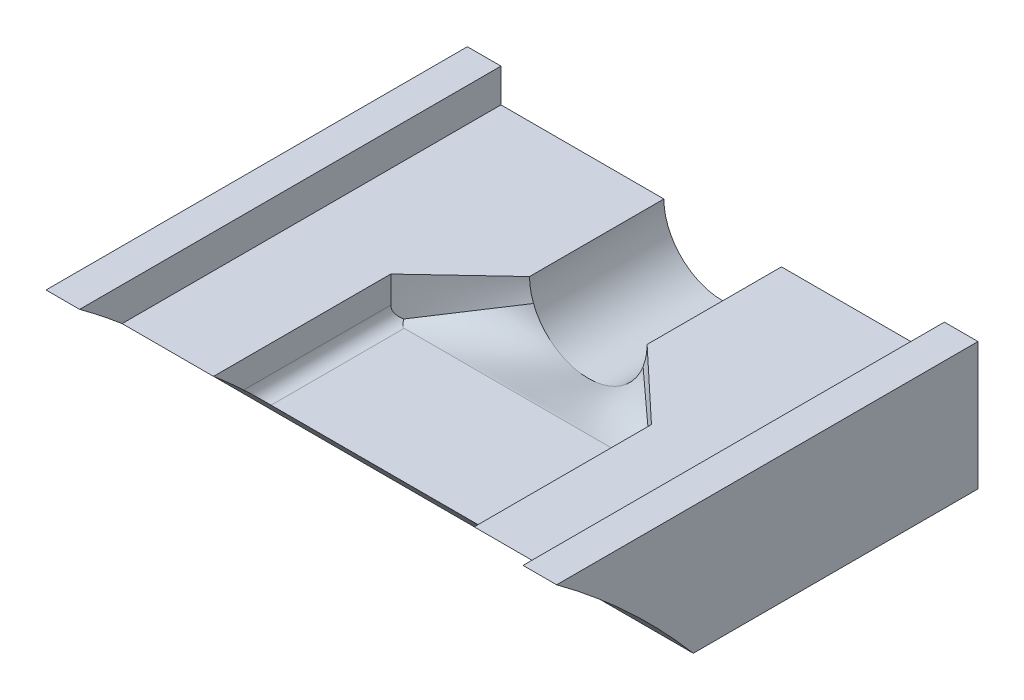
ISO-10303-21;
HEADER;
FILE_DESCRIPTION(('STEP AP214'),'2;1');
FILE_NAME('part.step','',(''),(''),'','','');
FILE_SCHEMA(('AUTOMOTIVE_DESIGN { 1 0 10303 214 1 1 1 1 }'));
ENDSEC;
DATA;
#1=APPLICATION_CONTEXT('core data for automotive mechanical design processes');
#2=APPLICATION_PROTOCOL_DEFINITION('international standard','automotive_design',2000,#1);
#3=PRODUCT_CONTEXT('',#1,'mechanical');
#4=PRODUCT('Part','Part','',(#3));
#5=PRODUCT_RELATED_PRODUCT_CATEGORY('part','',(#4));
#6=PRODUCT_DEFINITION_FORMATION('','',#4);
#7=PRODUCT_DEFINITION_CONTEXT('part definition',#1,'design');
#8=PRODUCT_DEFINITION('design','',#6,#7);
#9=PRODUCT_DEFINITION_SHAPE('','',#8);
#10=(LENGTH_UNIT() NAMED_UNIT(*) SI_UNIT(.MILLI.,.METRE.));
#11=(NAMED_UNIT(*) PLANE_ANGLE_UNIT() SI_UNIT($,.RADIAN.));
#12=(NAMED_UNIT(*) SI_UNIT($,.STERADIAN.) SOLID_ANGLE_UNIT());
#13=UNCERTAINTY_MEASURE_WITH_UNIT(LENGTH_MEASURE(1.E-05),#10,'distance_accuracy_value','');
#14=(GEOMETRIC_REPRESENTATION_CONTEXT(3) GLOBAL_UNCERTAINTY_ASSIGNED_CONTEXT((#13)) GLOBAL_UNIT_ASSIGNED_CONTEXT((#10,
#11,#12)) REPRESENTATION_CONTEXT('',''));
#15=CARTESIAN_POINT('',(0.,0.,0.));
#16=DIRECTION('',(0.,0.,1.));
#17=DIRECTION('',(1.,0.,0.));
#18=AXIS2_PLACEMENT_3D('',#15,#16,#17);
#19=CARTESIAN_POINT('',(-23.495,6.35,50.8));
#20=DIRECTION('',(0.,-1.,0.));
#21=DIRECTION('',(0.,0.,-1.));
#22=AXIS2_PLACEMENT_3D('',#19,#20,#21);
#23=PLANE('',#22);
#24=DIRECTION('',(0.,0.,-1.));
#25=VECTOR('',#24,1.);
#26=CARTESIAN_POINT('',(-20.32,6.35,50.800025));
#27=LINE('',#26,#25);
#28=CARTESIAN_POINT('',(-20.32,6.35,35.8059844851895));
#29=VERTEX_POINT('',#28);
#30=CARTESIAN_POINT('',(-20.32,6.35,0.));
#31=VERTEX_POINT('',#30);
#32=EDGE_CURVE('E504',#29,#31,#27,.T.);
#33=ORIENTED_EDGE('',*,*,#32,.F.);
#34=DIRECTION('',(1.,0.,0.));
#35=VECTOR('',#34,1.);
#36=CARTESIAN_POINT('',(-23.495,6.35,35.8059844851895));
#37=LINE('',#36,#35);
#38=CARTESIAN_POINT('',(-11.684,6.35,35.8059844851895));
#39=VERTEX_POINT('',#38);
#40=EDGE_CURVE('E602',#29,#39,#37,.T.);
#41=ORIENTED_EDGE('',*,*,#40,.T.);
#42=DIRECTION('',(0.,0.,1.));
#43=VECTOR('',#42,1.);
#44=CARTESIAN_POINT('',(-11.684,6.35,19.05));
#45=LINE('',#44,#43);
#46=CARTESIAN_POINT('',(-11.684,6.35,19.05));
#47=VERTEX_POINT('',#46);
#48=EDGE_CURVE('E297',#47,#39,#45,.T.);
#49=ORIENTED_EDGE('',*,*,#48,.F.);
#50=CARTESIAN_POINT('',(-4.92125,6.35,12.7));
#51=CARTESIAN_POINT('',(-7.1755,6.35,14.8166666666667));
#52=CARTESIAN_POINT('',(-9.42975,6.35,16.9333333333333));
#53=CARTESIAN_POINT('',(-11.684,6.35,19.05));
#54=B_SPLINE_CURVE_WITH_KNOTS('',3,(#50,#51,#52,#53),.UNSPECIFIED.,.F.,.F.,(4,4),(0.,1.),.UNSPECIFIED.);
#55=CARTESIAN_POINT('',(-4.92125,6.35,12.7));
#56=VERTEX_POINT('',#55);
#57=EDGE_CURVE('E572',#56,#47,#54,.T.);
#58=ORIENTED_EDGE('',*,*,#57,.F.);
#59=DIRECTION('',(0.,0.,-1.));
#60=VECTOR('',#59,1.);
#61=CARTESIAN_POINT('',(-4.92125,6.35,12.7));
#62=LINE('',#61,#60);
#63=CARTESIAN_POINT('',(-4.92125,6.35,0.));
#64=VERTEX_POINT('',#63);
#65=EDGE_CURVE('E244',#64,#56,#62,.F.);
#66=ORIENTED_EDGE('',*,*,#65,.F.);
#67=DIRECTION('',(-1.,0.,0.));
#68=VECTOR('',#67,1.);
#69=CARTESIAN_POINT('',(-23.495,6.35,0.));
#70=LINE('',#69,#68);
#71=EDGE_CURVE('E546',#64,#31,#70,.T.);
#72=ORIENTED_EDGE('',*,*,#71,.T.);
#73=EDGE_LOOP('',(#33,#41,#49,#58,#66,#72));
#74=FACE_BOUND('',#73,.T.);
#75=ADVANCED_FACE('F67',(#74),#23,.F.);
#76=DIRECTION('',(0.,0.,1.));
#77=VECTOR('',#76,1.);
#78=CARTESIAN_POINT('',(12.954,6.35,19.05));
#79=LINE('',#78,#77);
#80=CARTESIAN_POINT('',(12.954,6.35,19.05));
#81=VERTEX_POINT('',#80);
#82=CARTESIAN_POINT('',(12.954,6.35,35.8059844851895));
#83=VERTEX_POINT('',#82);
#84=EDGE_CURVE('E289',#81,#83,#79,.T.);
#85=ORIENTED_EDGE('',*,*,#84,.T.);
#86=DIRECTION('',(1.,0.,0.));
#87=VECTOR('',#86,1.);
#88=CARTESIAN_POINT('',(-23.495,6.35,35.8059844851895));
#89=LINE('',#88,#87);
#90=CARTESIAN_POINT('',(21.59,6.34999999999997,35.8059844851895));
#91=VERTEX_POINT('',#90);
#92=EDGE_CURVE('E526',#83,#91,#89,.T.);
#93=ORIENTED_EDGE('',*,*,#92,.T.);
#94=DIRECTION('',(0.,0.,-1.));
#95=VECTOR('',#94,1.);
#96=CARTESIAN_POINT('',(21.59,6.35,50.800025));
#97=LINE('',#96,#95);
#98=CARTESIAN_POINT('',(21.59,6.35,0.));
#99=VERTEX_POINT('',#98);
#100=EDGE_CURVE('E210',#91,#99,#97,.T.);
#101=ORIENTED_EDGE('',*,*,#100,.T.);
#102=CARTESIAN_POINT('',(6.19125,6.35,0.));
#103=VERTEX_POINT('',#102);
#104=EDGE_CURVE('E545',#99,#103,#70,.T.);
#105=ORIENTED_EDGE('',*,*,#104,.T.);
#106=DIRECTION('',(0.,0.,-1.));
#107=VECTOR('',#106,1.);
#108=CARTESIAN_POINT('',(6.19125,6.35,12.7));
#109=LINE('',#108,#107);
#110=CARTESIAN_POINT('',(6.19125,6.35,12.7));
#111=VERTEX_POINT('',#110);
#112=EDGE_CURVE('E623',#111,#103,#109,.T.);
#113=ORIENTED_EDGE('',*,*,#112,.F.);
#114=CARTESIAN_POINT('',(12.954,6.35,19.05));
#115=CARTESIAN_POINT('',(10.69975,6.35,16.9333333333333));
#116=CARTESIAN_POINT('',(8.4455,6.35,14.8166666666667));
#117=CARTESIAN_POINT('',(6.19125,6.35,12.7));
#118=B_SPLINE_CURVE_WITH_KNOTS('',3,(#114,#115,#116,#117),.UNSPECIFIED.,.F.,.F.,(4,4),(0.,1.),.UNSPECIFIED.);
#119=EDGE_CURVE('E568',#111,#81,#118,.F.);
#120=ORIENTED_EDGE('',*,*,#119,.T.);
#121=EDGE_LOOP('',(#85,#93,#101,#105,#113,#120));
#122=FACE_BOUND('',#121,.T.);
#123=ADVANCED_FACE('F264',(#122),#23,.F.);
#124=CARTESIAN_POINT('',(0.,0.,0.));
#125=DIRECTION('',(0.,0.,1.));
#126=DIRECTION('',(1.,0.,0.));
#127=AXIS2_PLACEMENT_3D('',#124,#125,#126);
#128=PLANE('',#127);
#129=CARTESIAN_POINT('',(0.635,6.34999999999999,0.));
#130=DIRECTION('',(0.,0.,1.));
#131=DIRECTION('',(1.,0.,0.));
#132=AXIS2_PLACEMENT_3D('',#129,#130,#131);
#133=CIRCLE('',#132,5.55625);
#134=EDGE_CURVE('E227',#103,#64,#133,.F.);
#135=ORIENTED_EDGE('',*,*,#134,.F.);
#136=ORIENTED_EDGE('',*,*,#104,.F.);
#137=DIRECTION('',(0.,1.,0.));
#138=VECTOR('',#137,1.);
#139=CARTESIAN_POINT('',(21.59,6.35,0.));
#140=LINE('',#139,#138);
#141=CARTESIAN_POINT('',(21.59,9.525,0.));
#142=VERTEX_POINT('',#141);
#143=EDGE_CURVE('E532',#99,#142,#140,.T.);
#144=ORIENTED_EDGE('',*,*,#143,.T.);
#145=DIRECTION('',(1.,0.,0.));
#146=VECTOR('',#145,1.);
#147=CARTESIAN_POINT('',(21.59,9.525,0.));
#148=LINE('',#147,#146);
#149=CARTESIAN_POINT('',(24.765,9.525,0.));
#150=VERTEX_POINT('',#149);
#151=EDGE_CURVE('E529',#142,#150,#148,.T.);
#152=ORIENTED_EDGE('',*,*,#151,.T.);
#153=DIRECTION('',(0.,1.,0.));
#154=VECTOR('',#153,1.);
#155=CARTESIAN_POINT('',(24.765,6.35,0.));
#156=LINE('',#155,#154);
#157=CARTESIAN_POINT('',(24.765,-2.54,0.));
#158=VERTEX_POINT('',#157);
#159=EDGE_CURVE('E549',#158,#150,#156,.T.);
#160=ORIENTED_EDGE('',*,*,#159,.F.);
#161=DIRECTION('',(1.,0.,0.));
#162=VECTOR('',#161,1.);
#163=CARTESIAN_POINT('',(-23.495,-2.54,0.));
#164=LINE('',#163,#162);
#165=CARTESIAN_POINT('',(-23.495,-2.54,0.));
#166=VERTEX_POINT('',#165);
#167=EDGE_CURVE('E223',#166,#158,#164,.T.);
#168=ORIENTED_EDGE('',*,*,#167,.F.);
#169=DIRECTION('',(0.,-1.,0.));
#170=VECTOR('',#169,1.);
#171=CARTESIAN_POINT('',(-23.495,6.35,0.));
#172=LINE('',#171,#170);
#173=CARTESIAN_POINT('',(-23.495,9.525,0.));
#174=VERTEX_POINT('',#173);
#175=EDGE_CURVE('E229',#174,#166,#172,.T.);
#176=ORIENTED_EDGE('',*,*,#175,.F.);
#177=DIRECTION('',(-1.,0.,0.));
#178=VECTOR('',#177,1.);
#179=CARTESIAN_POINT('',(0.,9.525,0.));
#180=LINE('',#179,#178);
#181=CARTESIAN_POINT('',(-20.32,9.525,0.));
#182=VERTEX_POINT('',#181);
#183=EDGE_CURVE('E509',#182,#174,#180,.T.);
#184=ORIENTED_EDGE('',*,*,#183,.F.);
#185=DIRECTION('',(0.,1.,0.));
#186=VECTOR('',#185,1.);
#187=CARTESIAN_POINT('',(-20.32,0.,0.));
#188=LINE('',#187,#186);
#189=EDGE_CURVE('E500',#31,#182,#188,.T.);
#190=ORIENTED_EDGE('',*,*,#189,.F.);
#191=ORIENTED_EDGE('',*,*,#71,.F.);
#192=EDGE_LOOP('',(#135,#136,#144,#152,#160,#168,#176,#184,#190,#191));
#193=FACE_BOUND('',#192,.T.);
#194=ADVANCED_FACE('F261',(#193),#128,.F.);
#195=CARTESIAN_POINT('',(24.765,6.35,50.8));
#196=DIRECTION('',(-1.,0.,0.));
#197=DIRECTION('',(0.,0.,1.));
#198=AXIS2_PLACEMENT_3D('',#195,#196,#197);
#199=PLANE('',#198);
#200=DIRECTION('',(0.,0.,-1.));
#201=VECTOR('',#200,1.);
#202=CARTESIAN_POINT('',(24.765,9.525,50.800025));
#203=LINE('',#202,#201);
#204=CARTESIAN_POINT('',(24.765,9.525,39.8240109496798));
#205=VERTEX_POINT('',#204);
#206=EDGE_CURVE('E219',#205,#150,#203,.T.);
#207=ORIENTED_EDGE('',*,*,#206,.F.);
#208=CARTESIAN_POINT('',(24.765,-51.8160000000001,85.0315514600857));
#209=DIRECTION('',(1.,0.,0.));
#210=DIRECTION('',(0.,0.,-1.));
#211=AXIS2_PLACEMENT_3D('',#208,#209,#210);
#212=CIRCLE('',#211,76.2);
#213=CARTESIAN_POINT('',(24.765,-2.54,26.9082702037767));
#214=VERTEX_POINT('',#213);
#215=EDGE_CURVE('E203',#214,#205,#212,.T.);
#216=ORIENTED_EDGE('',*,*,#215,.F.);
#217=DIRECTION('',(0.,0.,-1.));
#218=VECTOR('',#217,1.);
#219=CARTESIAN_POINT('',(24.765,-2.54,50.8));
#220=LINE('',#219,#218);
#221=EDGE_CURVE('E217',#214,#158,#220,.T.);
#222=ORIENTED_EDGE('',*,*,#221,.T.);
#223=ORIENTED_EDGE('',*,*,#159,.T.);
#224=EDGE_LOOP('',(#207,#216,#222,#223));
#225=FACE_BOUND('',#224,.T.);
#226=ADVANCED_FACE('F215',(#225),#199,.F.);
#227=CARTESIAN_POINT('',(-23.495,6.35,50.8));
#228=DIRECTION('',(1.,0.,0.));
#229=DIRECTION('',(0.,0.,-1.));
#230=AXIS2_PLACEMENT_3D('',#227,#228,#229);
#231=PLANE('',#230);
#232=DIRECTION('',(0.,0.,-1.));
#233=VECTOR('',#232,1.);
#234=CARTESIAN_POINT('',(-23.495,-2.54,50.8));
#235=LINE('',#234,#233);
#236=CARTESIAN_POINT('',(-23.495,-2.54,26.9082702037767));
#237=VERTEX_POINT('',#236);
#238=EDGE_CURVE('E225',#237,#166,#235,.T.);
#239=ORIENTED_EDGE('',*,*,#238,.F.);
#240=CARTESIAN_POINT('',(-23.495,-51.8160000000001,85.0315514600857));
#241=DIRECTION('',(1.,0.,0.));
#242=DIRECTION('',(0.,0.,-1.));
#243=AXIS2_PLACEMENT_3D('',#240,#241,#242);
#244=CIRCLE('',#243,76.2);
#245=CARTESIAN_POINT('',(-23.495,9.525,39.8240109496798));
#246=VERTEX_POINT('',#245);
#247=EDGE_CURVE('E206',#237,#246,#244,.T.);
#248=ORIENTED_EDGE('',*,*,#247,.T.);
#249=DIRECTION('',(0.,0.,-1.));
#250=VECTOR('',#249,1.);
#251=CARTESIAN_POINT('',(-23.495,9.525,50.800025));
#252=LINE('',#251,#250);
#253=EDGE_CURVE('E505',#246,#174,#252,.T.);
#254=ORIENTED_EDGE('',*,*,#253,.T.);
#255=ORIENTED_EDGE('',*,*,#175,.T.);
#256=EDGE_LOOP('',(#239,#248,#254,#255));
#257=FACE_BOUND('',#256,.T.);
#258=ADVANCED_FACE('F268',(#257),#231,.F.);
#259=CARTESIAN_POINT('',(-23.495,-2.54,50.8));
#260=DIRECTION('',(0.,1.,0.));
#261=DIRECTION('',(0.,0.,1.));
#262=AXIS2_PLACEMENT_3D('',#259,#260,#261);
#263=PLANE('',#262);
#264=ORIENTED_EDGE('',*,*,#221,.F.);
#265=DIRECTION('',(1.,0.,0.));
#266=VECTOR('',#265,1.);
#267=CARTESIAN_POINT('',(-23.495,-2.54,26.9082702037768));
#268=LINE('',#267,#266);
#269=EDGE_CURVE('E200',#214,#237,#268,.F.);
#270=ORIENTED_EDGE('',*,*,#269,.T.);
#271=ORIENTED_EDGE('',*,*,#238,.T.);
#272=ORIENTED_EDGE('',*,*,#167,.T.);
#273=EDGE_LOOP('',(#264,#270,#271,#272));
#274=FACE_BOUND('',#273,.T.);
#275=ADVANCED_FACE('F221',(#274),#263,.F.);
#276=CARTESIAN_POINT('',(0.635,6.34999999999999,12.7));
#277=DIRECTION('',(0.,0.,-1.));
#278=DIRECTION('',(-1.,0.,0.));
#279=AXIS2_PLACEMENT_3D('',#276,#277,#278);
#280=CYLINDRICAL_SURFACE('',#279,5.55625);
#281=ORIENTED_EDGE('',*,*,#65,.T.);
#282=CARTESIAN_POINT('',(-4.54312270854848,4.33531409948982,12.7));
#283=CARTESIAN_POINT('',(-4.60541918850231,4.49542780129806,12.7));
#284=CARTESIAN_POINT('',(-4.71515084943679,4.82144223525843,12.7));
#285=CARTESIAN_POINT('',(-4.83373627413655,5.32359085422753,12.7));
#286=CARTESIAN_POINT('',(-4.90530254184817,5.83458103714851,12.7));
#287=CARTESIAN_POINT('',(-4.92125,6.17819415341328,12.7));
#288=CARTESIAN_POINT('',(-4.92125,6.35,12.7));
#289=B_SPLINE_CURVE_WITH_KNOTS('',3,(#282,#283,#284,#285,#286,#287,#288),.UNSPECIFIED.,.F.,.F.,
(4,1,1,1,4),(0.,0.0295275590551181,0.0590551181102362,0.0885826771653544,0.118110236220472),.UNSPECIFIED.);
#290=CARTESIAN_POINT('',(-4.5431494251816,4.33530365676075,12.7));
#291=VERTEX_POINT('',#290);
#292=EDGE_CURVE('E239',#56,#291,#289,.F.);
#293=ORIENTED_EDGE('',*,*,#292,.T.);
#294=CARTESIAN_POINT('',(0.635,6.34999999999999,12.7));
#295=DIRECTION('',(0.,0.,1.));
#296=DIRECTION('',(1.,0.,0.));
#297=AXIS2_PLACEMENT_3D('',#294,#295,#296);
#298=CIRCLE('',#297,5.55625);
#299=CARTESIAN_POINT('',(5.81313583325495,4.33530897595926,12.7));
#300=VERTEX_POINT('',#299);
#301=EDGE_CURVE('E516',#291,#300,#298,.T.);
#302=ORIENTED_EDGE('',*,*,#301,.T.);
#303=EDGE_CURVE('E358',#300,#111,#298,.T.);
#304=ORIENTED_EDGE('',*,*,#303,.T.);
#305=ORIENTED_EDGE('',*,*,#112,.T.);
#306=ORIENTED_EDGE('',*,*,#134,.T.);
#307=EDGE_LOOP('',(#281,#293,#302,#304,#305,#306));
#308=FACE_BOUND('',#307,.T.);
#309=ADVANCED_FACE('F248',(#308),#280,.F.);
#310=CARTESIAN_POINT('',(-11.684,6.35,19.05));
#311=DIRECTION('',(-1.,0.,0.));
#312=DIRECTION('',(0.,-1.,0.));
#313=AXIS2_PLACEMENT_3D('',#310,#311,#312);
#314=PLANE('',#313);
#315=CARTESIAN_POINT('',(-11.684,-51.8160000000001,85.0315514600857));
#316=DIRECTION('',(-1.,0.,0.));
#317=DIRECTION('',(0.,-1.,0.));
#318=AXIS2_PLACEMENT_3D('',#315,#316,#317);
#319=CIRCLE('',#318,76.2);
#320=CARTESIAN_POINT('',(-11.684,3.81,32.952879011568));
#321=VERTEX_POINT('',#320);
#322=EDGE_CURVE('E599',#39,#321,#319,.T.);
#323=ORIENTED_EDGE('',*,*,#322,.T.);
#324=DIRECTION('',(0.,0.,1.));
#325=VECTOR('',#324,1.);
#326=CARTESIAN_POINT('',(-11.684,3.81,19.05));
#327=LINE('',#326,#325);
#328=CARTESIAN_POINT('',(-11.684,3.81,19.05));
#329=VERTEX_POINT('',#328);
#330=EDGE_CURVE('E87',#321,#329,#327,.F.);
#331=ORIENTED_EDGE('',*,*,#330,.T.);
#332=CARTESIAN_POINT('',(-11.684,6.35,19.05));
#333=CARTESIAN_POINT('',(-11.684,6.0325,19.05));
#334=CARTESIAN_POINT('',(-11.684,5.3975,19.05));
#335=CARTESIAN_POINT('',(-11.684,4.445,19.05));
#336=CARTESIAN_POINT('',(-11.684,3.4925,19.05));
#337=CARTESIAN_POINT('',(-11.684,2.8575,19.05));
#338=CARTESIAN_POINT('',(-11.684,2.54,19.05));
#339=B_SPLINE_CURVE_WITH_KNOTS('',3,(#332,#333,#334,#335,#336,#337,#338),.UNSPECIFIED.,.F.,.F.,
(4,1,1,1,4),(0.,0.0295275590551181,0.0590551181102362,0.0885826771653544,0.118110236220472),.UNSPECIFIED.);
#340=EDGE_CURVE('E303',#47,#329,#339,.T.);
#341=ORIENTED_EDGE('',*,*,#340,.F.);
#342=ORIENTED_EDGE('',*,*,#48,.T.);
#343=EDGE_LOOP('',(#323,#331,#341,#342));
#344=FACE_BOUND('',#343,.T.);
#345=ADVANCED_FACE('F258',(#344),#314,.F.);
#346=CARTESIAN_POINT('',(12.954,2.54,19.05));
#347=DIRECTION('',(1.,0.,0.));
#348=DIRECTION('',(0.,0.,-1.));
#349=AXIS2_PLACEMENT_3D('',#346,#347,#348);
#350=PLANE('',#349);
#351=CARTESIAN_POINT('',(12.954,2.54,19.05));
#352=CARTESIAN_POINT('',(12.954,2.8575,19.05));
#353=CARTESIAN_POINT('',(12.954,3.4925,19.05));
#354=CARTESIAN_POINT('',(12.954,4.445,19.05));
#355=CARTESIAN_POINT('',(12.954,5.3975,19.05));
#356=CARTESIAN_POINT('',(12.954,6.0325,19.05));
#357=CARTESIAN_POINT('',(12.954,6.35,19.05));
#358=B_SPLINE_CURVE_WITH_KNOTS('',3,(#351,#352,#353,#354,#355,#356,#357),.UNSPECIFIED.,.F.,.F.,
(4,1,1,1,4),(0.881889763779528,0.911417322834646,0.940944881889764,0.970472440944882,1.),.UNSPECIFIED.);
#359=CARTESIAN_POINT('',(12.954,3.81,19.05));
#360=VERTEX_POINT('',#359);
#361=EDGE_CURVE('E298',#360,#81,#358,.T.);
#362=ORIENTED_EDGE('',*,*,#361,.F.);
#363=DIRECTION('',(0.,0.,1.));
#364=VECTOR('',#363,1.);
#365=CARTESIAN_POINT('',(12.954,3.81,31.6286932594239));
#366=LINE('',#365,#364);
#367=CARTESIAN_POINT('',(12.954,3.81,32.952879011568));
#368=VERTEX_POINT('',#367);
#369=EDGE_CURVE('E376',#360,#368,#366,.T.);
#370=ORIENTED_EDGE('',*,*,#369,.T.);
#371=CARTESIAN_POINT('',(12.954,-51.8160000000001,85.0315514600857));
#372=DIRECTION('',(1.,0.,0.));
#373=DIRECTION('',(0.,0.,-1.));
#374=AXIS2_PLACEMENT_3D('',#371,#372,#373);
#375=CIRCLE('',#374,76.2);
#376=EDGE_CURVE('E600',#368,#83,#375,.T.);
#377=ORIENTED_EDGE('',*,*,#376,.T.);
#378=ORIENTED_EDGE('',*,*,#84,.F.);
#379=EDGE_LOOP('',(#362,#370,#377,#378));
#380=FACE_BOUND('',#379,.T.);
#381=ADVANCED_FACE('F329',(#380),#350,.F.);
#382=CARTESIAN_POINT('',(-11.684,2.54,19.05));
#383=DIRECTION('',(0.,-1.,0.));
#384=DIRECTION('',(0.,0.,-1.));
#385=AXIS2_PLACEMENT_3D('',#382,#383,#384);
#386=PLANE('',#385);
#387=DIRECTION('',(1.,0.,0.));
#388=VECTOR('',#387,1.);
#389=CARTESIAN_POINT('',(-23.495,2.54,31.6286932594239));
#390=LINE('',#389,#388);
#391=CARTESIAN_POINT('',(-10.414,2.54,31.6286932594239));
#392=VERTEX_POINT('',#391);
#393=CARTESIAN_POINT('',(11.684,2.54,31.6286932594239));
#394=VERTEX_POINT('',#393);
#395=EDGE_CURVE('E597',#392,#394,#390,.T.);
#396=ORIENTED_EDGE('',*,*,#395,.T.);
#397=DIRECTION('',(0.,0.,1.));
#398=VECTOR('',#397,1.);
#399=CARTESIAN_POINT('',(11.684,2.54,19.05));
#400=LINE('',#399,#398);
#401=CARTESIAN_POINT('',(11.684,2.54,19.05));
#402=VERTEX_POINT('',#401);
#403=EDGE_CURVE('E590',#394,#402,#400,.F.);
#404=ORIENTED_EDGE('',*,*,#403,.T.);
#405=CARTESIAN_POINT('',(9.00561077567241,2.54,19.05));
#406=CARTESIAN_POINT('',(9.11721032668606,2.54,19.05));
#407=CARTESIAN_POINT('',(9.22880987769971,2.54,19.05));
#408=CARTESIAN_POINT('',(9.45200897972701,2.54,19.05));
#409=CARTESIAN_POINT('',(9.56360853074066,2.54,19.05));
#410=CARTESIAN_POINT('',(9.78680763276795,2.54,19.05));
#411=CARTESIAN_POINT('',(9.89840718378161,2.54,19.05));
#412=CARTESIAN_POINT('',(10.1216062858089,2.54,19.05));
#413=CARTESIAN_POINT('',(10.2332058368226,2.54,19.05));
#414=CARTESIAN_POINT('',(10.4564049388499,2.54,19.05));
#415=CARTESIAN_POINT('',(10.5680044898635,2.54,19.05));
#416=CARTESIAN_POINT('',(10.7912035918908,2.54,19.05));
#417=CARTESIAN_POINT('',(10.9028031429044,2.54,19.05));
#418=CARTESIAN_POINT('',(11.1260022449317,2.54,19.05));
#419=CARTESIAN_POINT('',(11.2376017959454,2.54,19.05));
#420=CARTESIAN_POINT('',(11.4608008979727,2.54,19.05));
#421=CARTESIAN_POINT('',(11.5724004489863,2.54,19.05));
#422=CARTESIAN_POINT('',(11.684,2.54,19.05));
#423=B_SPLINE_CURVE_WITH_KNOTS('',3,(#405,#406,#407,#408,#409,#410,#411,#412,#413,#414,#415,
#416,#417,#418,#419,#420,#421,#422),.UNSPECIFIED.,.F.,.F.,(4,2,2,2,2,2,2,2,4),(0.,
0.334798653040948,0.66959730608189,1.00439595912285,1.33919461216379,1.67399326520474,
2.00879191824569,2.34359057128663,2.67838922432759),.UNSPECIFIED.);
#424=CARTESIAN_POINT('',(9.00561077567241,2.54,19.05));
#425=VERTEX_POINT('',#424);
#426=EDGE_CURVE('E346',#425,#402,#423,.T.);
#427=ORIENTED_EDGE('',*,*,#426,.F.);
#428=CARTESIAN_POINT('',(-7.73561077567241,2.54,19.05));
#429=CARTESIAN_POINT('',(-7.27057684369061,2.54,19.05));
#430=CARTESIAN_POINT('',(-6.80554291170881,2.54,19.05));
#431=CARTESIAN_POINT('',(-5.8754750477452,2.54,19.05));
#432=CARTESIAN_POINT('',(-5.4104411157634,2.54,19.05));
#433=CARTESIAN_POINT('',(-4.4803732517998,2.54,19.05));
#434=CARTESIAN_POINT('',(-4.015339319818,2.54,19.05));
#435=CARTESIAN_POINT('',(-3.0852714558544,2.54,19.05));
#436=CARTESIAN_POINT('',(-2.6202375238726,2.54,19.05));
#437=CARTESIAN_POINT('',(-1.690169659909,2.54,19.05));
#438=CARTESIAN_POINT('',(-1.2251357279272,2.54,19.05));
#439=CARTESIAN_POINT('',(-0.295067863963597,2.54,19.05));
#440=CARTESIAN_POINT('',(0.169966068018204,2.54,19.05));
#441=CARTESIAN_POINT('',(1.10003393198181,2.54,19.05));
#442=CARTESIAN_POINT('',(1.5650678639636,2.54,19.05));
#443=CARTESIAN_POINT('',(2.49513572792721,2.54,19.05));
#444=CARTESIAN_POINT('',(2.96016965990901,2.54,19.05));
#445=CARTESIAN_POINT('',(3.89023752387261,2.54,19.05));
#446=CARTESIAN_POINT('',(4.35527145585441,2.54,19.05));
#447=CARTESIAN_POINT('',(5.28533931981801,2.54,19.05));
#448=CARTESIAN_POINT('',(5.75037325179981,2.54,19.05));
#449=CARTESIAN_POINT('',(6.68044111576341,2.54,19.05));
#450=CARTESIAN_POINT('',(7.14547504774521,2.54,19.05));
#451=CARTESIAN_POINT('',(8.07554291170881,2.54,19.05));
#452=CARTESIAN_POINT('',(8.54057684369061,2.54,19.05));
#453=CARTESIAN_POINT('',(9.00561077567241,2.54,19.05));
#454=B_SPLINE_CURVE_WITH_KNOTS('',3,(#428,#429,#430,#431,#432,#433,#434,#435,#436,#437,#438,
#439,#440,#441,#442,#443,#444,#445,#446,#447,#448,#449,#450,#451,#452,#453),.UNSPECIFIED.,.F.,
.F.,(4,2,2,2,2,2,2,2,2,2,2,2,4),(0.,1.3951017959454,2.7902035918908,4.1853053878362,
5.58040718378161,6.97550897972701,8.37061077567241,9.76571257161781,11.1608143675632,
12.5559161635086,13.951017959454,15.3461197553994,16.7412215513448),.UNSPECIFIED.);
#455=CARTESIAN_POINT('',(-7.73561077567239,2.54,19.05));
#456=VERTEX_POINT('',#455);
#457=EDGE_CURVE('E554',#456,#425,#454,.T.);
#458=ORIENTED_EDGE('',*,*,#457,.F.);
#459=CARTESIAN_POINT('',(-10.414,2.54,19.05));
#460=CARTESIAN_POINT('',(-10.3024004489864,2.54,19.05));
#461=CARTESIAN_POINT('',(-10.1908008979727,2.54,19.05));
#462=CARTESIAN_POINT('',(-9.96760179594541,2.54,19.05));
#463=CARTESIAN_POINT('',(-9.85600224493176,2.54,19.05));
#464=CARTESIAN_POINT('',(-9.63280314290446,2.54,19.05));
#465=CARTESIAN_POINT('',(-9.52120359189081,2.54,19.05));
#466=CARTESIAN_POINT('',(-9.29800448986351,2.54,19.05));
#467=CARTESIAN_POINT('',(-9.18640493884986,2.54,19.05));
#468=CARTESIAN_POINT('',(-8.96320583682256,2.54,19.05));
#469=CARTESIAN_POINT('',(-8.85160628580891,2.54,19.05));
#470=CARTESIAN_POINT('',(-8.62840718378161,2.54,19.05));
#471=CARTESIAN_POINT('',(-8.51680763276796,2.54,19.05));
#472=CARTESIAN_POINT('',(-8.29360853074066,2.54,19.05));
#473=CARTESIAN_POINT('',(-8.18200897972701,2.54,19.05));
#474=CARTESIAN_POINT('',(-7.95880987769971,2.54,19.05));
#475=CARTESIAN_POINT('',(-7.84721032668606,2.54,19.05));
#476=CARTESIAN_POINT('',(-7.73561077567241,2.54,19.05));
#477=B_SPLINE_CURVE_WITH_KNOTS('',3,(#459,#460,#461,#462,#463,#464,#465,#466,#467,#468,#469,
#470,#471,#472,#473,#474,#475,#476),.UNSPECIFIED.,.F.,.F.,(4,2,2,2,2,2,2,2,4),(0.,
0.33479865304095,0.6695973060819,1.00439595912285,1.3391946121638,1.67399326520475,
2.0087919182457,2.34359057128665,2.6783892243276),.UNSPECIFIED.);
#478=CARTESIAN_POINT('',(-10.414,2.54,19.05));
#479=VERTEX_POINT('',#478);
#480=EDGE_CURVE('E384',#479,#456,#477,.T.);
#481=ORIENTED_EDGE('',*,*,#480,.F.);
#482=DIRECTION('',(0.,0.,1.));
#483=VECTOR('',#482,1.);
#484=CARTESIAN_POINT('',(-10.414,2.54,31.6286932594239));
#485=LINE('',#484,#483);
#486=EDGE_CURVE('E378',#479,#392,#485,.T.);
#487=ORIENTED_EDGE('',*,*,#486,.T.);
#488=EDGE_LOOP('',(#396,#404,#427,#458,#481,#487));
#489=FACE_BOUND('',#488,.T.);
#490=ADVANCED_FACE('F319',(#489),#386,.F.);
#491=CARTESIAN_POINT('',(5.81312270854848,4.33531409948982,12.7));
#492=CARTESIAN_POINT('',(8.19341513903232,3.73687606632655,14.8166666666667));
#493=CARTESIAN_POINT('',(10.5737075695162,3.13843803316327,16.9333333333333));
#494=CARTESIAN_POINT('',(12.954,2.54,19.05));
#495=CARTESIAN_POINT('',(5.87541918850232,4.49542780129807,12.7));
#496=CARTESIAN_POINT('',(8.23494612566821,3.94945186753205,14.8166666666667));
#497=CARTESIAN_POINT('',(10.5944730628341,3.40347593376602,16.9333333333333));
#498=CARTESIAN_POINT('',(12.954,2.8575,19.05));
#499=CARTESIAN_POINT('',(5.98515050105473,4.82143904977917,12.7));
#500=CARTESIAN_POINT('',(8.30810033403649,4.37845936651945,14.8166666666667));
#501=CARTESIAN_POINT('',(10.6310501670182,3.93547968325972,16.9333333333333));
#502=CARTESIAN_POINT('',(12.954,3.4925,19.05));
#503=CARTESIAN_POINT('',(6.10373872167592,5.32360389487062,12.7));
#504=CARTESIAN_POINT('',(8.38715914778395,5.03073592991375,14.8166666666667));
#505=CARTESIAN_POINT('',(10.670579573892,4.73786796495687,16.9333333333333));
#506=CARTESIAN_POINT('',(12.954,4.445,19.05));
#507=CARTESIAN_POINT('',(6.17530171147245,5.83457794213246,12.7));
#508=CARTESIAN_POINT('',(8.43486780764829,5.68888529475497,14.8166666666667));
#509=CARTESIAN_POINT('',(10.6944339038241,5.54319264737749,16.9333333333333));
#510=CARTESIAN_POINT('',(12.954,5.3975,19.05));
#511=CARTESIAN_POINT('',(6.19125,6.17819415341328,12.7));
#512=CARTESIAN_POINT('',(8.4455,6.12962943560886,14.8166666666667));
#513=CARTESIAN_POINT('',(10.69975,6.08106471780443,16.9333333333333));
#514=CARTESIAN_POINT('',(12.954,6.0325,19.05));
#515=CARTESIAN_POINT('',(6.19125,6.35,12.7));
#516=CARTESIAN_POINT('',(8.4455,6.35,14.8166666666667));
#517=CARTESIAN_POINT('',(10.69975,6.35,16.9333333333333));
#518=CARTESIAN_POINT('',(12.954,6.35,19.05));
#519=B_SPLINE_SURFACE_WITH_KNOTS('',3,3,((#491,#492,#493,#494),(#495,#496,#497,#498),(#499,#500,
#501,#502),(#503,#504,#505,#506),(#507,#508,#509,#510),(#511,#512,#513,#514),(#515,#516,#517,
#518)),.UNSPECIFIED.,.F.,.F.,.F.,(4,1,1,1,4),(4,4),(0.881889763779528,0.911417322834646,
0.940944881889764,0.970472440944882,1.),(0.,1.),.UNSPECIFIED.);
#520=DIRECTION('',(0.734427394043756,-0.184645079555807,0.65308697542818));
#521=VECTOR('',#520,1.);
#522=CARTESIAN_POINT('',(9.38356135427424,3.43765704974491,15.875));
#523=LINE('',#522,#521);
#524=CARTESIAN_POINT('',(12.3062116346291,2.70286284420936,18.4739564759039));
#525=VERTEX_POINT('',#524);
#526=EDGE_CURVE('E395',#300,#525,#523,.T.);
#527=CARTESIAN_POINT('',(12.3062116346291,2.70286284420936,18.4739564759039));
#528=CARTESIAN_POINT('',(12.3806082738449,2.74466014926735,18.539078025734));
#529=CARTESIAN_POINT('',(12.4528324470112,2.79516991593388,18.6025823117069));
#530=CARTESIAN_POINT('',(12.5889492235374,2.9143180984767,18.7227516657826));
#531=CARTESIAN_POINT('',(12.6527540530392,2.98312789527944,18.77934428396));
#532=CARTESIAN_POINT('',(12.7436074658132,3.10753957896646,18.8603246559049));
#533=CARTESIAN_POINT('',(12.775130305858,3.15735826576366,18.8885217310118));
#534=CARTESIAN_POINT('',(12.8317353739927,3.26302491301347,18.9393056664718));
#535=CARTESIAN_POINT('',(12.8568346255837,3.31885636816686,18.9619073501646));
#536=CARTESIAN_POINT('',(12.8994287760335,3.43639024369925,19.0003724663319));
#537=CARTESIAN_POINT('',(12.916831622045,3.49815351426633,19.0161542812939));
#538=CARTESIAN_POINT('',(12.9421167016924,3.62508031955839,19.0391382642478));
#539=CARTESIAN_POINT('',(12.9500285355674,3.69023261794883,19.0463671059849));
#540=CARTESIAN_POINT('',(12.953224368945,3.76468602362864,19.0492900370008));
#541=CARTESIAN_POINT('',(12.9535152427557,3.77374904485316,19.0495562136879));
#542=CARTESIAN_POINT('',(12.953902627256,3.79187372452493,19.0499108009558));
#543=CARTESIAN_POINT('',(12.9539993305709,3.8009353753966,19.049999387713));
#544=CARTESIAN_POINT('',(12.954,3.81,19.05));
#545=B_SPLINE_CURVE_WITH_KNOTS('',3,(#527,#528,#529,#530,#531,#532,#533,#534,#535,#536,#537,
#538,#539,#540,#541,#542,#543,#544),.UNSPECIFIED.,.F.,.F.,(4,2,2,2,2,2,2,2,4),(0.,
0.323154089761592,0.649448154336379,0.844782642204755,1.03959397403923,1.23667618063807,
1.43314212266326,1.46035611163839,1.48754308982515),.UNSPECIFIED.);
#546=EDGE_CURVE('E441',#525,#360,#545,.T.);
#547=ORIENTED_EDGE('',*,*,#526,.T.);
#548=ORIENTED_EDGE('',*,*,#546,.T.);
#549=ORIENTED_EDGE('',*,*,#361,.T.);
#550=ORIENTED_EDGE('',*,*,#119,.F.);
#551=ORIENTED_EDGE('',*,*,#303,.F.);
#552=EDGE_LOOP('',(#547,#548,#549,#550,#551));
#553=FACE_BOUND('',#552,.T.);
#554=ADVANCED_FACE('F328',(#553),#519,.F.);
#555=CARTESIAN_POINT('',(-4.54312270854848,4.33531409948982,12.7));
#556=CARTESIAN_POINT('',(-6.92341513903232,3.73687606632654,14.8166666666667));
#557=CARTESIAN_POINT('',(-9.30370756951616,3.13843803316327,16.9333333333333));
#558=CARTESIAN_POINT('',(-11.684,2.54,19.05));
#559=CARTESIAN_POINT('',(-4.34169742306943,3.81761312955162,12.7));
#560=CARTESIAN_POINT('',(-6.44693717093518,3.39174208636775,14.8166666666667));
#561=CARTESIAN_POINT('',(-8.55217691880092,2.96587104318387,16.9333333333333));
#562=CARTESIAN_POINT('',(-10.6574166666667,2.54,19.05));
#563=CARTESIAN_POINT('',(-3.78250118888564,2.8430876581325,12.7));
#564=CARTESIAN_POINT('',(-5.38975079259043,2.742058438755,14.8166666666667));
#565=CARTESIAN_POINT('',(-6.99700039629522,2.6410292193775,16.9333333333333));
#566=CARTESIAN_POINT('',(-8.60425,2.54,19.05));
#567=CARTESIAN_POINT('',(-2.54910518588148,1.69449358490917,12.7));
#568=CARTESIAN_POINT('',(-3.54090345725432,1.97632905660612,14.8166666666667));
#569=CARTESIAN_POINT('',(-4.53270172862716,2.25816452830306,16.9333333333333));
#570=CARTESIAN_POINT('',(-5.52450000000001,2.54,19.05));
#571=CARTESIAN_POINT('',(-1.03146447209533,0.961553418947517,12.7));
#572=CARTESIAN_POINT('',(-1.50255964806355,1.48770227929834,14.8166666666667));
#573=CARTESIAN_POINT('',(-1.97365482403178,2.01385113964917,16.9333333333333));
#574=CARTESIAN_POINT('',(-2.44475000000001,2.54,19.05));
#575=CARTESIAN_POINT('',(0.635000000000002,0.709753618610011,12.7));
#576=CARTESIAN_POINT('',(0.634999999999999,1.31983574574001,14.8166666666667));
#577=CARTESIAN_POINT('',(0.634999999999997,1.92991787287,16.9333333333333));
#578=CARTESIAN_POINT('',(0.634999999999994,2.54,19.05));
#579=CARTESIAN_POINT('',(2.30146447209534,0.961553418947519,12.7));
#580=CARTESIAN_POINT('',(2.77255964806356,1.48770227929835,14.8166666666667));
#581=CARTESIAN_POINT('',(3.24365482403177,2.01385113964917,16.9333333333333));
#582=CARTESIAN_POINT('',(3.71474999999999,2.54,19.05));
#583=CARTESIAN_POINT('',(3.81910518588148,1.69449358490917,12.7));
#584=CARTESIAN_POINT('',(4.81090345725432,1.97632905660611,14.8166666666667));
#585=CARTESIAN_POINT('',(5.80270172862716,2.25816452830306,16.9333333333333));
#586=CARTESIAN_POINT('',(6.79449999999999,2.54,19.05));
#587=CARTESIAN_POINT('',(5.05250118888565,2.84308765813251,12.7));
#588=CARTESIAN_POINT('',(6.65975079259043,2.74205843875501,14.8166666666667));
#589=CARTESIAN_POINT('',(8.26700039629521,2.64102921937751,16.9333333333333));
#590=CARTESIAN_POINT('',(9.87424999999999,2.54,19.05));
#591=CARTESIAN_POINT('',(5.61169742306944,3.81761312955162,12.7));
#592=CARTESIAN_POINT('',(7.71693717093518,3.39174208636775,14.8166666666667));
#593=CARTESIAN_POINT('',(9.82217691880092,2.96587104318387,16.9333333333333));
#594=CARTESIAN_POINT('',(11.9274166666667,2.54,19.05));
#595=CARTESIAN_POINT('',(5.81312270854848,4.33531409948982,12.7));
#596=CARTESIAN_POINT('',(8.19341513903232,3.73687606632655,14.8166666666667));
#597=CARTESIAN_POINT('',(10.5737075695162,3.13843803316327,16.9333333333333));
#598=CARTESIAN_POINT('',(12.954,2.54,19.05));
#599=B_SPLINE_SURFACE_WITH_KNOTS('',3,3,((#555,#556,#557,#558),(#559,#560,#561,#562),(#563,#564,
#565,#566),(#567,#568,#569,#570),(#571,#572,#573,#574),(#575,#576,#577,#578),(#579,#580,#581,
#582),(#583,#584,#585,#586),(#587,#588,#589,#590),(#591,#592,#593,#594),(#595,#596,#597,#598)),
.UNSPECIFIED.,.F.,.F.,.F.,(4,1,1,1,1,1,1,1,4),(4,4),(0.118110236220472,0.213582677165354,
0.309055118110236,0.404527559055118,0.5,0.595472440944882,0.690944881889764,0.786417322834646,
0.881889763779528),(0.,1.),.UNSPECIFIED.);
#600=CARTESIAN_POINT('',(11.684,2.54,19.05));
#601=CARTESIAN_POINT('',(11.7000571490051,2.53999165841123,19.0500420476711));
#602=CARTESIAN_POINT('',(11.715992991423,2.54030399977764,19.0483508209311));
#603=CARTESIAN_POINT('',(11.7470079063719,2.54147316769582,19.0422195204477));
#604=CARTESIAN_POINT('',(11.7620975208094,2.54231950042971,19.0378324665705));
#605=CARTESIAN_POINT('',(11.7983161372606,2.54496898132654,19.0244354280594));
#606=CARTESIAN_POINT('',(11.8189621537385,2.54703464182926,19.0142225003428));
#607=CARTESIAN_POINT('',(11.8586827321285,2.5519100063932,18.9909486630769));
#608=CARTESIAN_POINT('',(11.8777384668208,2.55472731289233,18.9778589090944));
#609=CARTESIAN_POINT('',(11.9231783767566,2.56242156345056,18.9432781577021));
#610=CARTESIAN_POINT('',(11.9487102050486,2.56763922265642,18.920762698315));
#611=CARTESIAN_POINT('',(11.9976045556387,2.57907308137859,18.8736902830518));
#612=CARTESIAN_POINT('',(12.0209617277319,2.58529164598176,18.8491285599665));
#613=CARTESIAN_POINT('',(12.0661129691691,2.59861895102228,18.7987595354039));
#614=CARTESIAN_POINT('',(12.0879039178169,2.60572939519028,18.7729499096876));
#615=CARTESIAN_POINT('',(12.1302635238854,2.62077622942718,18.7205759350533));
#616=CARTESIAN_POINT('',(12.1508318013016,2.62871287419126,18.6940113552491));
#617=CARTESIAN_POINT('',(12.1947904570855,2.64695946257561,18.6353383233013));
#618=CARTESIAN_POINT('',(12.2179794956755,2.6574344551186,18.6031309902975));
#619=CARTESIAN_POINT('',(12.2629899302603,2.6793880913472,18.5386250065627));
#620=CARTESIAN_POINT('',(12.2848227488363,2.69085556348419,18.5063305429459));
#621=CARTESIAN_POINT('',(12.3062116346305,2.70286284420846,18.4739564759049));
#622=B_SPLINE_CURVE_WITH_KNOTS('',3,(#600,#601,#602,#603,#604,#605,#606,#607,#608,#609,#610,
#611,#612,#613,#614,#615,#616,#617,#618,#619,#620,#621),.UNSPECIFIED.,.F.,.F.,(4,2,2,2,2,2,2,2,
2,2,4),(0.,0.0478936472151964,0.0948742296105621,0.163867448909234,0.233586841959668,
0.336641137547255,0.439942619882642,0.54344453020107,0.646978442366326,0.770080209992305,
0.891942082754468),.UNSPECIFIED.);
#623=EDGE_CURVE('E440',#402,#525,#622,.T.);
#624=DIRECTION('',(-0.734427394043756,-0.184645079555806,0.65308697542818));
#625=VECTOR('',#624,1.);
#626=CARTESIAN_POINT('',(-8.11356135427424,3.43765704974491,15.875));
#627=LINE('',#626,#625);
#628=CARTESIAN_POINT('',(-11.0362116346291,2.70286284420936,18.4739564759039));
#629=VERTEX_POINT('',#628);
#630=EDGE_CURVE('E507',#291,#629,#627,.T.);
#631=CARTESIAN_POINT('',(-11.0362116346291,2.70286284420936,18.4739564759039));
#632=CARTESIAN_POINT('',(-11.0183538900315,2.69283260952932,18.5010041713921));
#633=CARTESIAN_POINT('',(-11.0001778468564,2.6831804649578,18.5279873147588));
#634=CARTESIAN_POINT('',(-10.9628289181354,2.66451678089258,18.5820428082489));
#635=CARTESIAN_POINT('',(-10.9436461435119,2.6555152036717,18.6091117557147));
#636=CARTESIAN_POINT('',(-10.9042682722535,2.63824865347577,18.6630018536162));
#637=CARTESIAN_POINT('',(-10.8840679728313,2.62998823075666,18.6898206728189));
#638=CARTESIAN_POINT('',(-10.8408894866107,2.61365518516088,18.7449424955008));
#639=CARTESIAN_POINT('',(-10.8178182133191,2.60564999070296,18.7731934517909));
#640=CARTESIAN_POINT('',(-10.7700556388711,2.59067681926568,18.8283658255772));
#641=CARTESIAN_POINT('',(-10.7453716817949,2.58370455617728,18.8552924086433));
#642=CARTESIAN_POINT('',(-10.6936996872826,2.57089653861424,18.9070058148717));
#643=CARTESIAN_POINT('',(-10.6667220321393,2.56505601822405,18.9318013550348));
#644=CARTESIAN_POINT('',(-10.6299870563889,2.55847486849496,18.960992084769));
#645=CARTESIAN_POINT('',(-10.6218109706838,2.55708922599442,18.9672252978466));
#646=CARTESIAN_POINT('',(-10.6051523775852,2.55443947718654,18.979299118495));
#647=CARTESIAN_POINT('',(-10.5966697599302,2.5531754152234,18.9851395825861));
#648=CARTESIAN_POINT('',(-10.5707968749892,2.54959649479925,19.001892017669));
#649=CARTESIAN_POINT('',(-10.5528990190029,2.54747973409835,19.0121028704589));
#650=CARTESIAN_POINT('',(-10.520059621831,2.54435590215346,19.0275151869562));
#651=CARTESIAN_POINT('',(-10.5054241701287,2.54320470346424,19.0333303856472));
#652=CARTESIAN_POINT('',(-10.4754094281348,2.54139751532933,19.0425974753166));
#653=CARTESIAN_POINT('',(-10.4600333503405,2.54073956178619,19.0460587344899));
#654=CARTESIAN_POINT('',(-10.4394290294569,2.54024443726092,19.0486882090827));
#655=CARTESIAN_POINT('',(-10.434361569437,2.54015304905981,19.0491770188111));
#656=CARTESIAN_POINT('',(-10.4241969207217,2.54003078072559,19.0498332429186));
#657=CARTESIAN_POINT('',(-10.4190996969184,2.53999999999004,19.0500001293276));
#658=CARTESIAN_POINT('',(-10.4139999999997,2.54,19.05));
#659=B_SPLINE_CURVE_WITH_KNOTS('',3,(#631,#632,#633,#634,#635,#636,#637,#638,#639,#640,#641,
#642,#643,#644,#645,#646,#647,#648,#649,#650,#651,#652,#653,#654,#655,#656,#657,#658),
.UNSPECIFIED.,.F.,.F.,(4,2,2,2,2,2,2,2,2,2,2,2,2,4),(0.,0.101785848347244,0.204895277397129,
0.308599692118993,0.420568647161398,0.532059130909242,0.643069393020617,0.674179687561149,
0.705301286304199,0.767222101252437,0.81445166061118,0.8614921385003,0.876758822314873,
0.892050523035354),.UNSPECIFIED.);
#660=EDGE_CURVE('E438',#629,#479,#659,.T.);
#661=ORIENTED_EDGE('',*,*,#426,.T.);
#662=ORIENTED_EDGE('',*,*,#623,.T.);
#663=ORIENTED_EDGE('',*,*,#526,.F.);
#664=ORIENTED_EDGE('',*,*,#301,.F.);
#665=ORIENTED_EDGE('',*,*,#630,.T.);
#666=ORIENTED_EDGE('',*,*,#660,.T.);
#667=ORIENTED_EDGE('',*,*,#480,.T.);
#668=ORIENTED_EDGE('',*,*,#457,.T.);
#669=EDGE_LOOP('',(#661,#662,#663,#664,#665,#666,#667,#668));
#670=FACE_BOUND('',#669,.T.);
#671=ADVANCED_FACE('F399',(#670),#599,.F.);
#672=CARTESIAN_POINT('',(-4.92125,6.35,12.7));
#673=CARTESIAN_POINT('',(-7.1755,6.35,14.8166666666667));
#674=CARTESIAN_POINT('',(-9.42975,6.35,16.9333333333333));
#675=CARTESIAN_POINT('',(-11.684,6.35,19.05));
#676=CARTESIAN_POINT('',(-4.92125,6.17819415341328,12.7));
#677=CARTESIAN_POINT('',(-7.1755,6.12962943560885,14.8166666666667));
#678=CARTESIAN_POINT('',(-9.42975,6.08106471780443,16.9333333333333));
#679=CARTESIAN_POINT('',(-11.684,6.0325,19.05));
#680=CARTESIAN_POINT('',(-4.90530254184817,5.83458103714851,12.7));
#681=CARTESIAN_POINT('',(-7.16486836123211,5.68888735809901,14.8166666666667));
#682=CARTESIAN_POINT('',(-9.42443418061605,5.5431936790495,16.9333333333333));
#683=CARTESIAN_POINT('',(-11.684,5.3975,19.05));
#684=CARTESIAN_POINT('',(-4.83373627413655,5.32359085422753,12.7));
#685=CARTESIAN_POINT('',(-7.11715751609104,5.03072723615168,14.8166666666667));
#686=CARTESIAN_POINT('',(-9.40057875804552,4.73786361807584,16.9333333333333));
#687=CARTESIAN_POINT('',(-11.684,4.445,19.05));
#688=CARTESIAN_POINT('',(-4.71515084943679,4.82144223525843,12.7));
#689=CARTESIAN_POINT('',(-7.0381005662912,4.37846149017229,14.8166666666667));
#690=CARTESIAN_POINT('',(-9.3610502831456,3.93548074508614,16.9333333333334));
#691=CARTESIAN_POINT('',(-11.684,3.4925,19.05));
#692=CARTESIAN_POINT('',(-4.60541918850231,4.49542780129806,12.7));
#693=CARTESIAN_POINT('',(-6.96494612566821,3.94945186753204,14.8166666666667));
#694=CARTESIAN_POINT('',(-9.32447306283411,3.40347593376602,16.9333333333333));
#695=CARTESIAN_POINT('',(-11.684,2.8575,19.05));
#696=CARTESIAN_POINT('',(-4.54312270854848,4.33531409948982,12.7));
#697=CARTESIAN_POINT('',(-6.92341513903232,3.73687606632654,14.8166666666667));
#698=CARTESIAN_POINT('',(-9.30370756951616,3.13843803316327,16.9333333333333));
#699=CARTESIAN_POINT('',(-11.684,2.54,19.05));
#700=B_SPLINE_SURFACE_WITH_KNOTS('',3,3,((#672,#673,#674,#675),(#676,#677,#678,#679),(#680,#681,
#682,#683),(#684,#685,#686,#687),(#688,#689,#690,#691),(#692,#693,#694,#695),(#696,#697,#698,
#699)),.UNSPECIFIED.,.F.,.F.,.F.,(4,1,1,1,4),(4,4),(0.,0.0295275590551181,0.0590551181102362,
0.0885826771653544,0.118110236220472),(0.,1.),.UNSPECIFIED.);
#701=CARTESIAN_POINT('',(-11.684,3.81,19.05));
#702=CARTESIAN_POINT('',(-11.6840069189515,3.7806249093741,19.0500063890709));
#703=CARTESIAN_POINT('',(-11.6829810677421,3.75125555159133,19.0490665873796));
#704=CARTESIAN_POINT('',(-11.6789174003135,3.69279399819005,19.0453536621941));
#705=CARTESIAN_POINT('',(-11.6758810649467,3.66370161454864,19.0425818880696));
#706=CARTESIAN_POINT('',(-11.6678812325319,3.60624109948055,19.0352925024762));
#707=CARTESIAN_POINT('',(-11.6629329768653,3.57786908547695,19.0307886996347));
#708=CARTESIAN_POINT('',(-11.651205327476,3.52182683800845,19.0201323844055));
#709=CARTESIAN_POINT('',(-11.6444256826751,3.4941567013383,19.0139796459545));
#710=CARTESIAN_POINT('',(-11.6215450855556,3.4126250828443,18.9932492955689));
#711=CARTESIAN_POINT('',(-11.6028725767055,3.36003581696074,18.9763721728493));
#712=CARTESIAN_POINT('',(-11.5597078130979,3.25929717078442,18.9374919245492));
#713=CARTESIAN_POINT('',(-11.5352036795944,3.21115713493936,18.9154783380463));
#714=CARTESIAN_POINT('',(-11.4715214717211,3.10303460721457,18.8584538465726));
#715=CARTESIAN_POINT('',(-11.4302634584129,3.04522477312633,18.8216426439999));
#716=CARTESIAN_POINT('',(-11.3411266493108,2.93928295868302,18.742436241212));
#717=CARTESIAN_POINT('',(-11.2932341707836,2.89117149681608,18.7000295097491));
#718=CARTESIAN_POINT('',(-11.2101760629883,2.81960619198476,18.6267390723346));
#719=CARTESIAN_POINT('',(-11.1763592650033,2.79338851134636,18.596961599027));
#720=CARTESIAN_POINT('',(-11.1073020537966,2.7451095663443,18.5362692401778));
#721=CARTESIAN_POINT('',(-11.0720718524459,2.72302336238728,18.5053626211727));
#722=CARTESIAN_POINT('',(-11.0362116346291,2.70286284420936,18.4739564759039));
#723=B_SPLINE_CURVE_WITH_KNOTS('',3,(#701,#702,#703,#704,#705,#706,#707,#708,#709,#710,#711,
#712,#713,#714,#715,#716,#717,#718,#719,#720,#721,#722),.UNSPECIFIED.,.F.,.F.,(4,2,2,2,2,2,2,2,
2,2,4),(0.,0.08808309731384,0.176101387756081,0.263432030510425,0.350774652123512,
0.52483668566292,0.699256356754968,0.937946422731904,1.17713629549951,1.33334638184967,
1.48858072145627),.UNSPECIFIED.);
#724=EDGE_CURVE('E460',#329,#629,#723,.T.);
#725=ORIENTED_EDGE('',*,*,#340,.T.);
#726=ORIENTED_EDGE('',*,*,#724,.T.);
#727=ORIENTED_EDGE('',*,*,#630,.F.);
#728=ORIENTED_EDGE('',*,*,#292,.F.);
#729=ORIENTED_EDGE('',*,*,#57,.T.);
#730=EDGE_LOOP('',(#725,#726,#727,#728,#729));
#731=FACE_BOUND('',#730,.T.);
#732=ADVANCED_FACE('F409',(#731),#700,.F.);
#733=CARTESIAN_POINT('',(-20.32,0.,50.800025));
#734=DIRECTION('',(-1.,0.,0.));
#735=DIRECTION('',(0.,0.,1.));
#736=AXIS2_PLACEMENT_3D('',#733,#734,#735);
#737=PLANE('',#736);
#738=DIRECTION('',(0.,0.,-1.));
#739=VECTOR('',#738,1.);
#740=CARTESIAN_POINT('',(-20.32,9.525,50.800025));
#741=LINE('',#740,#739);
#742=CARTESIAN_POINT('',(-20.32,9.52499999999997,39.8240109496798));
#743=VERTEX_POINT('',#742);
#744=EDGE_CURVE('E496',#743,#182,#741,.T.);
#745=ORIENTED_EDGE('',*,*,#744,.F.);
#746=CARTESIAN_POINT('',(-20.32,-51.8160000000001,85.0315514600857));
#747=DIRECTION('',(-1.,0.,0.));
#748=DIRECTION('',(0.,0.,1.));
#749=AXIS2_PLACEMENT_3D('',#746,#747,#748);
#750=CIRCLE('',#749,76.2);
#751=EDGE_CURVE('E497',#743,#29,#750,.T.);
#752=ORIENTED_EDGE('',*,*,#751,.T.);
#753=ORIENTED_EDGE('',*,*,#32,.T.);
#754=ORIENTED_EDGE('',*,*,#189,.T.);
#755=EDGE_LOOP('',(#745,#752,#753,#754));
#756=FACE_BOUND('',#755,.T.);
#757=ADVANCED_FACE('F485',(#756),#737,.F.);
#758=CARTESIAN_POINT('',(0.,9.525,50.800025));
#759=DIRECTION('',(0.,-1.,0.));
#760=DIRECTION('',(0.,0.,-1.));
#761=AXIS2_PLACEMENT_3D('',#758,#759,#760);
#762=PLANE('',#761);
#763=ORIENTED_EDGE('',*,*,#253,.F.);
#764=DIRECTION('',(1.,0.,0.));
#765=VECTOR('',#764,1.);
#766=CARTESIAN_POINT('',(-23.495,9.52499999999998,39.8240109496798));
#767=LINE('',#766,#765);
#768=EDGE_CURVE('E211',#246,#743,#767,.T.);
#769=ORIENTED_EDGE('',*,*,#768,.T.);
#770=ORIENTED_EDGE('',*,*,#744,.T.);
#771=ORIENTED_EDGE('',*,*,#183,.T.);
#772=EDGE_LOOP('',(#763,#769,#770,#771));
#773=FACE_BOUND('',#772,.T.);
#774=ADVANCED_FACE('F479',(#773),#762,.F.);
#775=CARTESIAN_POINT('',(21.59,6.35,50.800025));
#776=DIRECTION('',(-1.,0.,0.));
#777=DIRECTION('',(0.,0.,1.));
#778=AXIS2_PLACEMENT_3D('',#775,#776,#777);
#779=PLANE('',#778);
#780=CARTESIAN_POINT('',(21.59,-51.8160000000001,85.0315514600857));
#781=DIRECTION('',(-1.,0.,0.));
#782=DIRECTION('',(0.,0.,1.));
#783=AXIS2_PLACEMENT_3D('',#780,#781,#782);
#784=CIRCLE('',#783,76.2);
#785=CARTESIAN_POINT('',(21.59,9.52499999999998,39.8240109496798));
#786=VERTEX_POINT('',#785);
#787=EDGE_CURVE('E519',#786,#91,#784,.T.);
#788=ORIENTED_EDGE('',*,*,#787,.F.);
#789=DIRECTION('',(0.,0.,-1.));
#790=VECTOR('',#789,1.);
#791=CARTESIAN_POINT('',(21.59,9.525,50.800025));
#792=LINE('',#791,#790);
#793=EDGE_CURVE('E524',#786,#142,#792,.T.);
#794=ORIENTED_EDGE('',*,*,#793,.T.);
#795=ORIENTED_EDGE('',*,*,#143,.F.);
#796=ORIENTED_EDGE('',*,*,#100,.F.);
#797=EDGE_LOOP('',(#788,#794,#795,#796));
#798=FACE_BOUND('',#797,.T.);
#799=ADVANCED_FACE('F475',(#798),#779,.T.);
#800=CARTESIAN_POINT('',(21.59,9.525,50.800025));
#801=DIRECTION('',(0.,1.,0.));
#802=DIRECTION('',(0.,0.,1.));
#803=AXIS2_PLACEMENT_3D('',#800,#801,#802);
#804=PLANE('',#803);
#805=DIRECTION('',(1.,0.,0.));
#806=VECTOR('',#805,1.);
#807=CARTESIAN_POINT('',(-23.495,9.52499999999998,39.8240109496798));
#808=LINE('',#807,#806);
#809=EDGE_CURVE('E234',#205,#786,#808,.F.);
#810=ORIENTED_EDGE('',*,*,#809,.F.);
#811=ORIENTED_EDGE('',*,*,#206,.T.);
#812=ORIENTED_EDGE('',*,*,#151,.F.);
#813=ORIENTED_EDGE('',*,*,#793,.F.);
#814=EDGE_LOOP('',(#810,#811,#812,#813));
#815=FACE_BOUND('',#814,.T.);
#816=ADVANCED_FACE('F474',(#815),#804,.T.);
#817=CARTESIAN_POINT('',(-23.495,-51.8160000000001,85.0315514600857));
#818=DIRECTION('',(1.,0.,0.));
#819=DIRECTION('',(0.,0.,-1.));
#820=AXIS2_PLACEMENT_3D('',#817,#818,#819);
#821=CYLINDRICAL_SURFACE('',#820,76.2);
#822=ORIENTED_EDGE('',*,*,#215,.T.);
#823=ORIENTED_EDGE('',*,*,#809,.T.);
#824=ORIENTED_EDGE('',*,*,#787,.T.);
#825=ORIENTED_EDGE('',*,*,#92,.F.);
#826=ORIENTED_EDGE('',*,*,#376,.F.);
#827=CARTESIAN_POINT('',(12.954,3.81,32.952879011568));
#828=CARTESIAN_POINT('',(12.9539835546629,3.76041753924275,32.899917761434));
#829=CARTESIAN_POINT('',(12.9510949161882,3.71074743234144,32.8470174388819));
#830=CARTESIAN_POINT('',(12.9393922864344,3.6114970241345,32.7416118671001));
#831=CARTESIAN_POINT('',(12.9305675141596,3.56191705109618,32.6891075127689));
#832=CARTESIAN_POINT('',(12.9066815051419,3.46275991254286,32.5843974305978));
#833=CARTESIAN_POINT('',(12.8915536106093,3.41318861970536,32.5322011311806));
#834=CARTESIAN_POINT('',(12.8547778589145,3.31510547454115,32.4292106159425));
#835=CARTESIAN_POINT('',(12.8331356444422,3.26659274413791,32.3784152280565));
#836=CARTESIAN_POINT('',(12.7754157430187,3.1568317521253,32.2637981264564));
#837=CARTESIAN_POINT('',(12.7369559407225,3.09612084052256,32.2006314271834));
#838=CARTESIAN_POINT('',(12.6474428182012,2.97929631895291,32.0794737077662));
#839=CARTESIAN_POINT('',(12.5964352754647,2.9231669641382,32.0214648949522));
#840=CARTESIAN_POINT('',(12.4952152063166,2.83108664309135,31.9265690534495));
#841=CARTESIAN_POINT('',(12.4479757611657,2.79359403128079,31.888021999623));
#842=CARTESIAN_POINT('',(12.3455723279071,2.72416605191013,31.8167720124098));
#843=CARTESIAN_POINT('',(12.2904158764795,2.69222546226472,31.7840635865754));
#844=CARTESIAN_POINT('',(12.184806134985,2.64176458724854,31.7324623035521));
#845=CARTESIAN_POINT('',(12.1357439732486,2.62183490743874,31.7121111277379));
#846=CARTESIAN_POINT('',(12.0336381402539,2.58789814494333,31.6774845558802));
#847=CARTESIAN_POINT('',(11.9806035946535,2.57387794993224,31.6631957079053));
#848=CARTESIAN_POINT('',(11.8868877645787,2.55567134763815,31.6446478234315));
#849=CARTESIAN_POINT('',(11.8468517544841,2.54983699916916,31.6387071666343));
#850=CARTESIAN_POINT('',(11.7658933835354,2.54198184618378,31.6307104726463));
#851=CARTESIAN_POINT('',(11.7249685140783,2.53997381174528,31.6286674435111));
#852=CARTESIAN_POINT('',(11.684,2.54,31.6286932594239));
#853=B_SPLINE_CURVE_WITH_KNOTS('',3,(#827,#828,#829,#830,#831,#832,#833,#834,#835,#836,#837,
#838,#839,#840,#841,#842,#843,#844,#845,#846,#847,#848,#849,#850,#851,#852),.UNSPECIFIED.,.F.,
.F.,(4,2,2,2,2,2,2,2,2,2,2,2,4),(0.,0.217612466824586,0.435621224611264,0.655996496312563,
0.87618142608172,1.16231224891725,1.44741428168192,1.66142724412761,1.87523780940922,
2.04477445047199,2.21393290735224,2.33625593742783,2.45898650259916),.UNSPECIFIED.);
#854=EDGE_CURVE('E80',#368,#394,#853,.T.);
#855=ORIENTED_EDGE('',*,*,#854,.T.);
#856=ORIENTED_EDGE('',*,*,#395,.F.);
#857=CARTESIAN_POINT('',(-10.414,2.54,31.6286932594239));
#858=CARTESIAN_POINT('',(-10.4422852194216,2.53999613488187,31.6286894957047));
#859=CARTESIAN_POINT('',(-10.4705529066033,2.54094578601623,31.6296559118079));
#860=CARTESIAN_POINT('',(-10.5268131204523,2.54470712813653,31.6334847197664));
#861=CARTESIAN_POINT('',(-10.5548058454958,2.54751735849546,31.6363456243748));
#862=CARTESIAN_POINT('',(-10.6375557348309,2.55860375390645,31.6476345766914));
#863=CARTESIAN_POINT('',(-10.6916252099157,2.569537537099,31.6587707613495));
#864=CARTESIAN_POINT('',(-10.7960867341972,2.59763142213283,31.6874130042921));
#865=CARTESIAN_POINT('',(-10.8464885496994,2.61477420303153,31.7049013426605));
#866=CARTESIAN_POINT('',(-10.9430236893803,2.65424850280914,31.7452227539588));
#867=CARTESIAN_POINT('',(-10.9891470216579,2.67659176031906,31.7680679193177));
#868=CARTESIAN_POINT('',(-11.0945946387814,2.73543704418658,31.8283267035421));
#869=CARTESIAN_POINT('',(-11.1515572458185,2.7739847478867,31.8678695978152));
#870=CARTESIAN_POINT('',(-11.2558982804877,2.85681433383717,31.9530536717558));
#871=CARTESIAN_POINT('',(-11.3032597368652,2.90110614686465,31.9987054172423));
#872=CARTESIAN_POINT('',(-11.4062975418219,3.01243529551352,32.1137719712002));
#873=CARTESIAN_POINT('',(-11.4575219780212,3.08139725710361,32.185300300535));
#874=CARTESIAN_POINT('',(-11.5436961882127,3.22379367335815,32.3336220568012));
#875=CARTESIAN_POINT('',(-11.5786022020182,3.29723956348698,32.4104290144099));
#876=CARTESIAN_POINT('',(-11.6325229436361,3.44394195817823,32.5645165626931));
#877=CARTESIAN_POINT('',(-11.6520213393412,3.51712566298537,32.6416989914749));
#878=CARTESIAN_POINT('',(-11.6713090197341,3.62712043303464,32.7582003609534));
#879=CARTESIAN_POINT('',(-11.6760787791292,3.6636815692594,32.7970055700895));
#880=CARTESIAN_POINT('',(-11.6824209689593,3.73683943968181,32.8748176453172));
#881=CARTESIAN_POINT('',(-11.6839945460868,3.77343615639809,32.913824434051));
#882=CARTESIAN_POINT('',(-11.684,3.81,32.952879011568));
#883=B_SPLINE_CURVE_WITH_KNOTS('',3,(#857,#858,#859,#860,#861,#862,#863,#864,#865,#866,#867,
#868,#869,#870,#871,#872,#873,#874,#875,#876,#877,#878,#879,#880,#881,#882),.UNSPECIFIED.,.F.,
.F.,(4,2,2,2,2,2,2,2,2,2,2,2,4),(0.,0.0847900719362353,0.169513659172292,0.33736461527544,
0.504750887315837,0.672518715666988,0.909212432885357,1.14632095665017,1.47985965331941,
1.81428772251163,2.13774687072162,2.29825263439201,2.45870080331975),.UNSPECIFIED.);
#884=EDGE_CURVE('E13',#392,#321,#883,.T.);
#885=ORIENTED_EDGE('',*,*,#884,.T.);
#886=ORIENTED_EDGE('',*,*,#322,.F.);
#887=ORIENTED_EDGE('',*,*,#40,.F.);
#888=ORIENTED_EDGE('',*,*,#751,.F.);
#889=ORIENTED_EDGE('',*,*,#768,.F.);
#890=ORIENTED_EDGE('',*,*,#247,.F.);
#891=ORIENTED_EDGE('',*,*,#269,.F.);
#892=EDGE_LOOP('',(#822,#823,#824,#825,#826,#855,#856,#885,#886,#887,#888,#889,#890,#891));
#893=FACE_BOUND('',#892,.T.);
#894=ADVANCED_FACE('F202',(#893),#821,.F.);
#895=CARTESIAN_POINT('',(11.684,3.81,19.05));
#896=DIRECTION('',(0.,0.,-1.));
#897=DIRECTION('',(-1.,0.,0.));
#898=AXIS2_PLACEMENT_3D('',#895,#896,#897);
#899=CYLINDRICAL_SURFACE('',#898,1.27);
#900=ORIENTED_EDGE('',*,*,#623,.F.);
#901=ORIENTED_EDGE('',*,*,#403,.F.);
#902=ORIENTED_EDGE('',*,*,#854,.F.);
#903=ORIENTED_EDGE('',*,*,#369,.F.);
#904=ORIENTED_EDGE('',*,*,#546,.F.);
#905=EDGE_LOOP('',(#900,#901,#902,#903,#904));
#906=FACE_BOUND('',#905,.T.);
#907=ADVANCED_FACE('F448',(#906),#899,.F.);
#908=CARTESIAN_POINT('',(-10.414,3.81,19.05));
#909=DIRECTION('',(0.,0.,-1.));
#910=DIRECTION('',(-1.,0.,0.));
#911=AXIS2_PLACEMENT_3D('',#908,#909,#910);
#912=CYLINDRICAL_SURFACE('',#911,1.27);
#913=ORIENTED_EDGE('',*,*,#724,.F.);
#914=ORIENTED_EDGE('',*,*,#330,.F.);
#915=ORIENTED_EDGE('',*,*,#884,.F.);
#916=ORIENTED_EDGE('',*,*,#486,.F.);
#917=ORIENTED_EDGE('',*,*,#660,.F.);
#918=EDGE_LOOP('',(#913,#914,#915,#916,#917));
#919=FACE_BOUND('',#918,.T.);
#920=ADVANCED_FACE('F69',(#919),#912,.F.);
#921=CLOSED_SHELL('',(#75,#123,#194,#226,#258,#275,#309,#345,#381,#490,#554,#671,#732,#757,#774,
#799,#816,#894,#907,#920));
#922=MANIFOLD_SOLID_BREP('B2',#921);
#923=ADVANCED_BREP_SHAPE_REPRESENTATION('',(#18,#922),#14);
#924=SHAPE_DEFINITION_REPRESENTATION(#9,#923);
ENDSEC;
END-ISO-10303-21;
